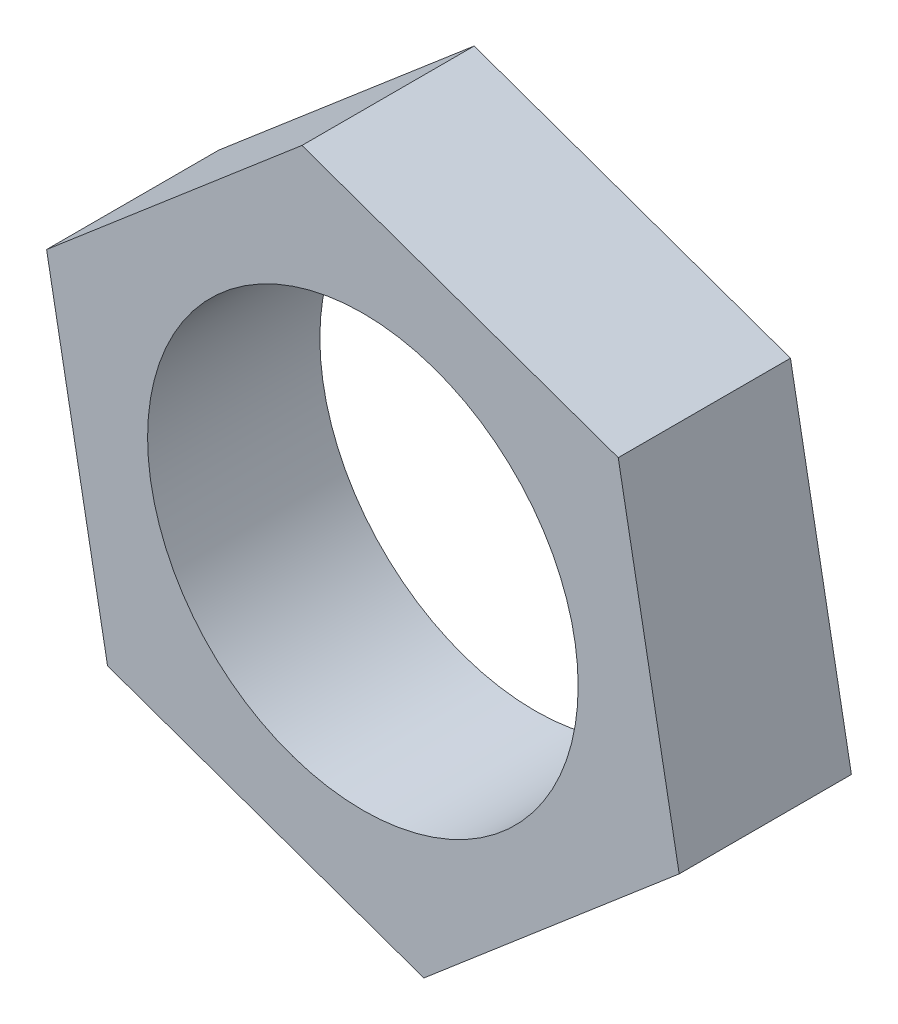
ISO-10303-21;
HEADER;
FILE_DESCRIPTION(('STEP AP214'),'2;1');
FILE_NAME('part.step','',(''),(''),'','','');
FILE_SCHEMA(('AUTOMOTIVE_DESIGN { 1 0 10303 214 1 1 1 1 }'));
ENDSEC;
DATA;
#1=APPLICATION_CONTEXT('core data for automotive mechanical design processes');
#2=APPLICATION_PROTOCOL_DEFINITION('international standard','automotive_design',2000,#1);
#3=PRODUCT_CONTEXT('',#1,'mechanical');
#4=PRODUCT('Part','Part','',(#3));
#5=PRODUCT_RELATED_PRODUCT_CATEGORY('part','',(#4));
#6=PRODUCT_DEFINITION_FORMATION('','',#4);
#7=PRODUCT_DEFINITION_CONTEXT('part definition',#1,'design');
#8=PRODUCT_DEFINITION('design','',#6,#7);
#9=PRODUCT_DEFINITION_SHAPE('','',#8);
#10=(LENGTH_UNIT() NAMED_UNIT(*) SI_UNIT(.MILLI.,.METRE.));
#11=(NAMED_UNIT(*) PLANE_ANGLE_UNIT() SI_UNIT($,.RADIAN.));
#12=(NAMED_UNIT(*) SI_UNIT($,.STERADIAN.) SOLID_ANGLE_UNIT());
#13=UNCERTAINTY_MEASURE_WITH_UNIT(LENGTH_MEASURE(1.E-05),#10,'distance_accuracy_value','');
#14=(GEOMETRIC_REPRESENTATION_CONTEXT(3) GLOBAL_UNCERTAINTY_ASSIGNED_CONTEXT((#13)) GLOBAL_UNIT_ASSIGNED_CONTEXT((#10,
#11,#12)) REPRESENTATION_CONTEXT('',''));
#15=CARTESIAN_POINT('',(0.,0.,0.));
#16=DIRECTION('',(0.,0.,1.));
#17=DIRECTION('',(1.,0.,0.));
#18=AXIS2_PLACEMENT_3D('',#15,#16,#17);
#19=CARTESIAN_POINT('',(14.690994638725,-5.21293358148292,8.));
#20=DIRECTION('',(0.,0.,1.));
#21=DIRECTION('',(1.,0.,0.));
#22=AXIS2_PLACEMENT_3D('',#19,#20,#21);
#23=PLANE('',#22);
#24=DIRECTION('',(0.760821293934121,0.648961446232679,0.));
#25=VECTOR('',#24,1.);
#26=CARTESIAN_POINT('',(2.83096440955728,-15.3292413547383,8.));
#27=LINE('',#26,#25);
#28=CARTESIAN_POINT('',(2.83096440955728,-15.3292413547383,8.));
#29=VERTEX_POINT('',#28);
#30=CARTESIAN_POINT('',(14.690994638725,-5.21293358148292,8.));
#31=VERTEX_POINT('',#30);
#32=EDGE_CURVE('E128',#29,#31,#27,.T.);
#33=ORIENTED_EDGE('',*,*,#32,.T.);
#34=DIRECTION('',(-0.181606451547129,0.983371291403435,0.));
#35=VECTOR('',#34,1.);
#36=CARTESIAN_POINT('',(14.690994638725,-5.21293358148292,8.));
#37=LINE('',#36,#35);
#38=CARTESIAN_POINT('',(11.8600302291677,10.1163077732554,8.));
#39=VERTEX_POINT('',#38);
#40=EDGE_CURVE('E86',#31,#39,#37,.T.);
#41=ORIENTED_EDGE('',*,*,#40,.T.);
#42=DIRECTION('',(-0.942427745481249,0.334409845170757,0.));
#43=VECTOR('',#42,1.);
#44=CARTESIAN_POINT('',(11.8600302291677,10.1163077732554,8.));
#45=LINE('',#44,#43);
#46=CARTESIAN_POINT('',(-2.83096440955728,15.3292413547384,8.));
#47=VERTEX_POINT('',#46);
#48=EDGE_CURVE('E99',#39,#47,#45,.T.);
#49=ORIENTED_EDGE('',*,*,#48,.T.);
#50=DIRECTION('',(-0.760821293934121,-0.648961446232679,0.));
#51=VECTOR('',#50,1.);
#52=CARTESIAN_POINT('',(-2.83096440955728,15.3292413547384,8.));
#53=LINE('',#52,#51);
#54=CARTESIAN_POINT('',(-14.690994638725,5.21293358148295,8.));
#55=VERTEX_POINT('',#54);
#56=EDGE_CURVE('E93',#47,#55,#53,.T.);
#57=ORIENTED_EDGE('',*,*,#56,.T.);
#58=DIRECTION('',(0.181606451547128,-0.983371291403436,0.));
#59=VECTOR('',#58,1.);
#60=CARTESIAN_POINT('',(-14.690994638725,5.21293358148295,8.));
#61=LINE('',#60,#59);
#62=CARTESIAN_POINT('',(-11.8600302291677,-10.1163077732554,8.));
#63=VERTEX_POINT('',#62);
#64=EDGE_CURVE('E97',#55,#63,#61,.T.);
#65=ORIENTED_EDGE('',*,*,#64,.T.);
#66=DIRECTION('',(0.942427745481249,-0.334409845170757,0.));
#67=VECTOR('',#66,1.);
#68=CARTESIAN_POINT('',(-11.8600302291677,-10.1163077732554,8.));
#69=LINE('',#68,#67);
#70=EDGE_CURVE('E49',#63,#29,#69,.T.);
#71=ORIENTED_EDGE('',*,*,#70,.T.);
#72=EDGE_LOOP('',(#33,#41,#49,#57,#65,#71));
#73=FACE_BOUND('',#72,.T.);
#74=CARTESIAN_POINT('',(0.,0.,8.));
#75=DIRECTION('',(0.,0.,1.));
#76=DIRECTION('',(1.,0.,0.));
#77=AXIS2_PLACEMENT_3D('',#74,#75,#76);
#78=CIRCLE('',#77,10.);
#79=CARTESIAN_POINT('',(10.,0.,8.));
#80=VERTEX_POINT('',#79);
#81=EDGE_CURVE('E121',#80,#80,#78,.T.);
#82=ORIENTED_EDGE('',*,*,#81,.F.);
#83=EDGE_LOOP('',(#82));
#84=FACE_BOUND('',#83,.T.);
#85=ADVANCED_FACE('F32',(#73,#84),#23,.T.);
#86=CARTESIAN_POINT('',(14.690994638725,-5.21293358148292,0.));
#87=DIRECTION('',(0.,0.,1.));
#88=DIRECTION('',(1.,0.,0.));
#89=AXIS2_PLACEMENT_3D('',#86,#87,#88);
#90=PLANE('',#89);
#91=DIRECTION('',(0.760821293934121,0.648961446232679,0.));
#92=VECTOR('',#91,1.);
#93=CARTESIAN_POINT('',(2.83096440955728,-15.3292413547383,0.));
#94=LINE('',#93,#92);
#95=CARTESIAN_POINT('',(2.83096440955728,-15.3292413547383,0.));
#96=VERTEX_POINT('',#95);
#97=CARTESIAN_POINT('',(14.690994638725,-5.21293358148292,0.));
#98=VERTEX_POINT('',#97);
#99=EDGE_CURVE('E117',#96,#98,#94,.T.);
#100=ORIENTED_EDGE('',*,*,#99,.F.);
#101=DIRECTION('',(0.942427745481249,-0.334409845170757,0.));
#102=VECTOR('',#101,1.);
#103=CARTESIAN_POINT('',(-11.8600302291677,-10.1163077732554,0.));
#104=LINE('',#103,#102);
#105=CARTESIAN_POINT('',(-11.8600302291677,-10.1163077732554,0.));
#106=VERTEX_POINT('',#105);
#107=EDGE_CURVE('E78',#106,#96,#104,.T.);
#108=ORIENTED_EDGE('',*,*,#107,.F.);
#109=DIRECTION('',(0.181606451547128,-0.983371291403436,0.));
#110=VECTOR('',#109,1.);
#111=CARTESIAN_POINT('',(-14.690994638725,5.21293358148295,0.));
#112=LINE('',#111,#110);
#113=CARTESIAN_POINT('',(-14.690994638725,5.21293358148295,0.));
#114=VERTEX_POINT('',#113);
#115=EDGE_CURVE('E72',#114,#106,#112,.T.);
#116=ORIENTED_EDGE('',*,*,#115,.F.);
#117=DIRECTION('',(-0.760821293934121,-0.648961446232679,0.));
#118=VECTOR('',#117,1.);
#119=CARTESIAN_POINT('',(-2.83096440955728,15.3292413547384,0.));
#120=LINE('',#119,#118);
#121=CARTESIAN_POINT('',(-2.83096440955728,15.3292413547384,0.));
#122=VERTEX_POINT('',#121);
#123=EDGE_CURVE('E107',#122,#114,#120,.T.);
#124=ORIENTED_EDGE('',*,*,#123,.F.);
#125=DIRECTION('',(-0.942427745481249,0.334409845170757,0.));
#126=VECTOR('',#125,1.);
#127=CARTESIAN_POINT('',(11.8600302291677,10.1163077732554,0.));
#128=LINE('',#127,#126);
#129=CARTESIAN_POINT('',(11.8600302291677,10.1163077732554,0.));
#130=VERTEX_POINT('',#129);
#131=EDGE_CURVE('E123',#130,#122,#128,.T.);
#132=ORIENTED_EDGE('',*,*,#131,.F.);
#133=DIRECTION('',(-0.181606451547129,0.983371291403435,0.));
#134=VECTOR('',#133,1.);
#135=CARTESIAN_POINT('',(14.690994638725,-5.21293358148292,0.));
#136=LINE('',#135,#134);
#137=EDGE_CURVE('E120',#98,#130,#136,.T.);
#138=ORIENTED_EDGE('',*,*,#137,.F.);
#139=EDGE_LOOP('',(#100,#108,#116,#124,#132,#138));
#140=FACE_BOUND('',#139,.T.);
#141=CARTESIAN_POINT('',(0.,0.,0.));
#142=DIRECTION('',(0.,0.,1.));
#143=DIRECTION('',(1.,0.,0.));
#144=AXIS2_PLACEMENT_3D('',#141,#142,#143);
#145=CIRCLE('',#144,10.);
#146=CARTESIAN_POINT('',(10.,0.,0.));
#147=VERTEX_POINT('',#146);
#148=EDGE_CURVE('E221',#147,#147,#145,.T.);
#149=ORIENTED_EDGE('',*,*,#148,.T.);
#150=EDGE_LOOP('',(#149));
#151=FACE_BOUND('',#150,.T.);
#152=ADVANCED_FACE('F137',(#140,#151),#90,.F.);
#153=CARTESIAN_POINT('',(2.83096440955728,-15.3292413547383,8.));
#154=DIRECTION('',(-0.648961446232679,0.760821293934121,0.));
#155=DIRECTION('',(-0.760821293934121,-0.648961446232679,0.));
#156=AXIS2_PLACEMENT_3D('',#153,#154,#155);
#157=PLANE('',#156);
#158=ORIENTED_EDGE('',*,*,#99,.T.);
#159=DIRECTION('',(0.,0.,-1.));
#160=VECTOR('',#159,1.);
#161=CARTESIAN_POINT('',(14.690994638725,-5.21293358148292,8.));
#162=LINE('',#161,#160);
#163=EDGE_CURVE('E11',#31,#98,#162,.T.);
#164=ORIENTED_EDGE('',*,*,#163,.F.);
#165=ORIENTED_EDGE('',*,*,#32,.F.);
#166=DIRECTION('',(0.,0.,-1.));
#167=VECTOR('',#166,1.);
#168=CARTESIAN_POINT('',(2.83096440955728,-15.3292413547383,8.));
#169=LINE('',#168,#167);
#170=EDGE_CURVE('E113',#29,#96,#169,.T.);
#171=ORIENTED_EDGE('',*,*,#170,.T.);
#172=EDGE_LOOP('',(#158,#164,#165,#171));
#173=FACE_BOUND('',#172,.T.);
#174=ADVANCED_FACE('F34',(#173),#157,.F.);
#175=CARTESIAN_POINT('',(14.690994638725,-5.21293358148292,8.));
#176=DIRECTION('',(-0.983371291403435,-0.181606451547129,0.));
#177=DIRECTION('',(0.181606451547129,-0.983371291403435,0.));
#178=AXIS2_PLACEMENT_3D('',#175,#176,#177);
#179=PLANE('',#178);
#180=ORIENTED_EDGE('',*,*,#137,.T.);
#181=DIRECTION('',(0.,0.,-1.));
#182=VECTOR('',#181,1.);
#183=CARTESIAN_POINT('',(11.8600302291677,10.1163077732554,8.));
#184=LINE('',#183,#182);
#185=EDGE_CURVE('E41',#39,#130,#184,.T.);
#186=ORIENTED_EDGE('',*,*,#185,.F.);
#187=ORIENTED_EDGE('',*,*,#40,.F.);
#188=ORIENTED_EDGE('',*,*,#163,.T.);
#189=EDGE_LOOP('',(#180,#186,#187,#188));
#190=FACE_BOUND('',#189,.T.);
#191=ADVANCED_FACE('F162',(#190),#179,.F.);
#192=CARTESIAN_POINT('',(11.8600302291677,10.1163077732554,8.));
#193=DIRECTION('',(-0.334409845170757,-0.942427745481249,0.));
#194=DIRECTION('',(0.942427745481249,-0.334409845170757,0.));
#195=AXIS2_PLACEMENT_3D('',#192,#193,#194);
#196=PLANE('',#195);
#197=ORIENTED_EDGE('',*,*,#131,.T.);
#198=DIRECTION('',(0.,0.,-1.));
#199=VECTOR('',#198,1.);
#200=CARTESIAN_POINT('',(-2.83096440955728,15.3292413547384,8.));
#201=LINE('',#200,#199);
#202=EDGE_CURVE('E108',#47,#122,#201,.T.);
#203=ORIENTED_EDGE('',*,*,#202,.F.);
#204=ORIENTED_EDGE('',*,*,#48,.F.);
#205=ORIENTED_EDGE('',*,*,#185,.T.);
#206=EDGE_LOOP('',(#197,#203,#204,#205));
#207=FACE_BOUND('',#206,.T.);
#208=ADVANCED_FACE('F134',(#207),#196,.F.);
#209=CARTESIAN_POINT('',(-2.83096440955728,15.3292413547384,8.));
#210=DIRECTION('',(0.648961446232679,-0.760821293934121,0.));
#211=DIRECTION('',(0.760821293934121,0.648961446232679,0.));
#212=AXIS2_PLACEMENT_3D('',#209,#210,#211);
#213=PLANE('',#212);
#214=ORIENTED_EDGE('',*,*,#123,.T.);
#215=DIRECTION('',(0.,0.,-1.));
#216=VECTOR('',#215,1.);
#217=CARTESIAN_POINT('',(-14.690994638725,5.21293358148295,8.));
#218=LINE('',#217,#216);
#219=EDGE_CURVE('E104',#55,#114,#218,.T.);
#220=ORIENTED_EDGE('',*,*,#219,.F.);
#221=ORIENTED_EDGE('',*,*,#56,.F.);
#222=ORIENTED_EDGE('',*,*,#202,.T.);
#223=EDGE_LOOP('',(#214,#220,#221,#222));
#224=FACE_BOUND('',#223,.T.);
#225=ADVANCED_FACE('F105',(#224),#213,.F.);
#226=CARTESIAN_POINT('',(-14.690994638725,5.21293358148295,8.));
#227=DIRECTION('',(0.983371291403436,0.181606451547128,0.));
#228=DIRECTION('',(-0.181606451547128,0.983371291403436,0.));
#229=AXIS2_PLACEMENT_3D('',#226,#227,#228);
#230=PLANE('',#229);
#231=ORIENTED_EDGE('',*,*,#115,.T.);
#232=DIRECTION('',(0.,0.,-1.));
#233=VECTOR('',#232,1.);
#234=CARTESIAN_POINT('',(-11.8600302291677,-10.1163077732554,8.));
#235=LINE('',#234,#233);
#236=EDGE_CURVE('E109',#63,#106,#235,.T.);
#237=ORIENTED_EDGE('',*,*,#236,.F.);
#238=ORIENTED_EDGE('',*,*,#64,.F.);
#239=ORIENTED_EDGE('',*,*,#219,.T.);
#240=EDGE_LOOP('',(#231,#237,#238,#239));
#241=FACE_BOUND('',#240,.T.);
#242=ADVANCED_FACE('F111',(#241),#230,.F.);
#243=CARTESIAN_POINT('',(-11.8600302291677,-10.1163077732554,8.));
#244=DIRECTION('',(0.334409845170758,0.942427745481249,0.));
#245=DIRECTION('',(-0.942427745481249,0.334409845170758,0.));
#246=AXIS2_PLACEMENT_3D('',#243,#244,#245);
#247=PLANE('',#246);
#248=ORIENTED_EDGE('',*,*,#107,.T.);
#249=ORIENTED_EDGE('',*,*,#170,.F.);
#250=ORIENTED_EDGE('',*,*,#70,.F.);
#251=ORIENTED_EDGE('',*,*,#236,.T.);
#252=EDGE_LOOP('',(#248,#249,#250,#251));
#253=FACE_BOUND('',#252,.T.);
#254=ADVANCED_FACE('F142',(#253),#247,.F.);
#255=CARTESIAN_POINT('',(0.,0.,8.));
#256=DIRECTION('',(0.,0.,-1.));
#257=DIRECTION('',(-1.,0.,0.));
#258=AXIS2_PLACEMENT_3D('',#255,#256,#257);
#259=CYLINDRICAL_SURFACE('',#258,10.);
#260=ORIENTED_EDGE('',*,*,#81,.T.);
#261=EDGE_LOOP('',(#260));
#262=FACE_BOUND('',#261,.T.);
#263=ORIENTED_EDGE('',*,*,#148,.F.);
#264=EDGE_LOOP('',(#263));
#265=FACE_BOUND('',#264,.T.);
#266=ADVANCED_FACE('F144',(#262,#265),#259,.F.);
#267=CLOSED_SHELL('',(#85,#152,#174,#191,#208,#225,#242,#254,#266));
#268=MANIFOLD_SOLID_BREP('B2',#267);
#269=ADVANCED_BREP_SHAPE_REPRESENTATION('',(#18,#268),#14);
#270=SHAPE_DEFINITION_REPRESENTATION(#9,#269);
ENDSEC;
END-ISO-10303-21;
